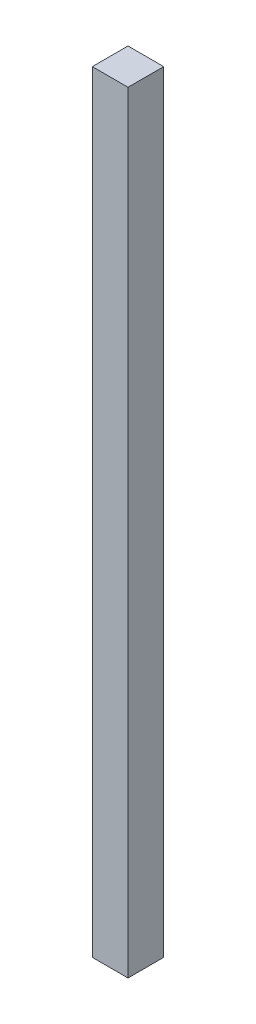
ISO-10303-21;
HEADER;
FILE_DESCRIPTION(('STEP AP214'),'2;1');
FILE_NAME('part.step','',(''),(''),'','','');
FILE_SCHEMA(('AUTOMOTIVE_DESIGN { 1 0 10303 214 1 1 1 1 }'));
ENDSEC;
DATA;
#1=APPLICATION_CONTEXT('core data for automotive mechanical design processes');
#2=APPLICATION_PROTOCOL_DEFINITION('international standard','automotive_design',2000,#1);
#3=PRODUCT_CONTEXT('',#1,'mechanical');
#4=PRODUCT('Part','Part','',(#3));
#5=PRODUCT_RELATED_PRODUCT_CATEGORY('part','',(#4));
#6=PRODUCT_DEFINITION_FORMATION('','',#4);
#7=PRODUCT_DEFINITION_CONTEXT('part definition',#1,'design');
#8=PRODUCT_DEFINITION('design','',#6,#7);
#9=PRODUCT_DEFINITION_SHAPE('','',#8);
#10=(LENGTH_UNIT() NAMED_UNIT(*) SI_UNIT(.MILLI.,.METRE.));
#11=(NAMED_UNIT(*) PLANE_ANGLE_UNIT() SI_UNIT($,.RADIAN.));
#12=(NAMED_UNIT(*) SI_UNIT($,.STERADIAN.) SOLID_ANGLE_UNIT());
#13=UNCERTAINTY_MEASURE_WITH_UNIT(LENGTH_MEASURE(1.E-05),#10,'distance_accuracy_value','');
#14=(GEOMETRIC_REPRESENTATION_CONTEXT(3) GLOBAL_UNCERTAINTY_ASSIGNED_CONTEXT((#13)) GLOBAL_UNIT_ASSIGNED_CONTEXT((#10,
#11,#12)) REPRESENTATION_CONTEXT('',''));
#15=CARTESIAN_POINT('',(0.,0.,0.));
#16=DIRECTION('',(0.,0.,1.));
#17=DIRECTION('',(1.,0.,0.));
#18=AXIS2_PLACEMENT_3D('',#15,#16,#17);
#19=CARTESIAN_POINT('',(0.,540.,0.));
#20=DIRECTION('',(-1.,0.,0.));
#21=DIRECTION('',(0.,0.,1.));
#22=AXIS2_PLACEMENT_3D('',#19,#20,#21);
#23=PLANE('',#22);
#24=DIRECTION('',(0.,0.,-1.));
#25=VECTOR('',#24,1.);
#26=CARTESIAN_POINT('',(0.,0.,0.));
#27=LINE('',#26,#25);
#28=CARTESIAN_POINT('',(0.,0.,25.));
#29=VERTEX_POINT('',#28);
#30=CARTESIAN_POINT('',(0.,0.,0.));
#31=VERTEX_POINT('',#30);
#32=EDGE_CURVE('E96',#29,#31,#27,.T.);
#33=ORIENTED_EDGE('',*,*,#32,.T.);
#34=DIRECTION('',(0.,-1.,0.));
#35=VECTOR('',#34,1.);
#36=CARTESIAN_POINT('',(0.,540.,0.));
#37=LINE('',#36,#35);
#38=CARTESIAN_POINT('',(0.,540.,0.));
#39=VERTEX_POINT('',#38);
#40=EDGE_CURVE('E11',#39,#31,#37,.T.);
#41=ORIENTED_EDGE('',*,*,#40,.F.);
#42=DIRECTION('',(0.,0.,-1.));
#43=VECTOR('',#42,1.);
#44=CARTESIAN_POINT('',(0.,540.,0.));
#45=LINE('',#44,#43);
#46=CARTESIAN_POINT('',(0.,540.,25.));
#47=VERTEX_POINT('',#46);
#48=EDGE_CURVE('E84',#47,#39,#45,.T.);
#49=ORIENTED_EDGE('',*,*,#48,.F.);
#50=DIRECTION('',(0.,-1.,0.));
#51=VECTOR('',#50,1.);
#52=CARTESIAN_POINT('',(0.,540.,25.));
#53=LINE('',#52,#51);
#54=EDGE_CURVE('E92',#47,#29,#53,.T.);
#55=ORIENTED_EDGE('',*,*,#54,.T.);
#56=EDGE_LOOP('',(#33,#41,#49,#55));
#57=FACE_BOUND('',#56,.T.);
#58=ADVANCED_FACE('F33',(#57),#23,.F.);
#59=CARTESIAN_POINT('',(0.,540.,0.));
#60=DIRECTION('',(0.,0.,1.));
#61=DIRECTION('',(1.,0.,0.));
#62=AXIS2_PLACEMENT_3D('',#59,#60,#61);
#63=PLANE('',#62);
#64=DIRECTION('',(-1.,0.,0.));
#65=VECTOR('',#64,1.);
#66=CARTESIAN_POINT('',(0.,0.,0.));
#67=LINE('',#66,#65);
#68=CARTESIAN_POINT('',(-25.,0.,0.));
#69=VERTEX_POINT('',#68);
#70=EDGE_CURVE('E88',#31,#69,#67,.T.);
#71=ORIENTED_EDGE('',*,*,#70,.T.);
#72=DIRECTION('',(0.,-1.,0.));
#73=VECTOR('',#72,1.);
#74=CARTESIAN_POINT('',(-25.,540.,0.));
#75=LINE('',#74,#73);
#76=CARTESIAN_POINT('',(-25.,540.,0.));
#77=VERTEX_POINT('',#76);
#78=EDGE_CURVE('E41',#77,#69,#75,.T.);
#79=ORIENTED_EDGE('',*,*,#78,.F.);
#80=DIRECTION('',(-1.,0.,0.));
#81=VECTOR('',#80,1.);
#82=CARTESIAN_POINT('',(0.,540.,0.));
#83=LINE('',#82,#81);
#84=EDGE_CURVE('E79',#39,#77,#83,.T.);
#85=ORIENTED_EDGE('',*,*,#84,.F.);
#86=ORIENTED_EDGE('',*,*,#40,.T.);
#87=EDGE_LOOP('',(#71,#79,#85,#86));
#88=FACE_BOUND('',#87,.T.);
#89=ADVANCED_FACE('F87',(#88),#63,.F.);
#90=CARTESIAN_POINT('',(-25.,540.,0.));
#91=DIRECTION('',(1.,0.,0.));
#92=DIRECTION('',(0.,0.,-1.));
#93=AXIS2_PLACEMENT_3D('',#90,#91,#92);
#94=PLANE('',#93);
#95=DIRECTION('',(0.,0.,1.));
#96=VECTOR('',#95,1.);
#97=CARTESIAN_POINT('',(-25.,0.,0.));
#98=LINE('',#97,#96);
#99=CARTESIAN_POINT('',(-25.,0.,25.));
#100=VERTEX_POINT('',#99);
#101=EDGE_CURVE('E66',#69,#100,#98,.T.);
#102=ORIENTED_EDGE('',*,*,#101,.T.);
#103=DIRECTION('',(0.,-1.,0.));
#104=VECTOR('',#103,1.);
#105=CARTESIAN_POINT('',(-25.,540.,25.));
#106=LINE('',#105,#104);
#107=CARTESIAN_POINT('',(-25.,540.,25.));
#108=VERTEX_POINT('',#107);
#109=EDGE_CURVE('E89',#108,#100,#106,.T.);
#110=ORIENTED_EDGE('',*,*,#109,.F.);
#111=DIRECTION('',(0.,0.,1.));
#112=VECTOR('',#111,1.);
#113=CARTESIAN_POINT('',(-25.,540.,0.));
#114=LINE('',#113,#112);
#115=EDGE_CURVE('E82',#77,#108,#114,.T.);
#116=ORIENTED_EDGE('',*,*,#115,.F.);
#117=ORIENTED_EDGE('',*,*,#78,.T.);
#118=EDGE_LOOP('',(#102,#110,#116,#117));
#119=FACE_BOUND('',#118,.T.);
#120=ADVANCED_FACE('F90',(#119),#94,.F.);
#121=CARTESIAN_POINT('',(0.,540.,25.));
#122=DIRECTION('',(0.,0.,-1.));
#123=DIRECTION('',(-1.,0.,0.));
#124=AXIS2_PLACEMENT_3D('',#121,#122,#123);
#125=PLANE('',#124);
#126=DIRECTION('',(1.,0.,0.));
#127=VECTOR('',#126,1.);
#128=CARTESIAN_POINT('',(0.,0.,25.));
#129=LINE('',#128,#127);
#130=EDGE_CURVE('E72',#100,#29,#129,.T.);
#131=ORIENTED_EDGE('',*,*,#130,.T.);
#132=ORIENTED_EDGE('',*,*,#54,.F.);
#133=DIRECTION('',(1.,0.,0.));
#134=VECTOR('',#133,1.);
#135=CARTESIAN_POINT('',(0.,540.,25.));
#136=LINE('',#135,#134);
#137=EDGE_CURVE('E49',#108,#47,#136,.T.);
#138=ORIENTED_EDGE('',*,*,#137,.F.);
#139=ORIENTED_EDGE('',*,*,#109,.T.);
#140=EDGE_LOOP('',(#131,#132,#138,#139));
#141=FACE_BOUND('',#140,.T.);
#142=ADVANCED_FACE('F103',(#141),#125,.F.);
#143=CARTESIAN_POINT('',(0.,540.,0.));
#144=DIRECTION('',(0.,-1.,0.));
#145=DIRECTION('',(0.,0.,-1.));
#146=AXIS2_PLACEMENT_3D('',#143,#144,#145);
#147=PLANE('',#146);
#148=ORIENTED_EDGE('',*,*,#48,.T.);
#149=ORIENTED_EDGE('',*,*,#84,.T.);
#150=ORIENTED_EDGE('',*,*,#115,.T.);
#151=ORIENTED_EDGE('',*,*,#137,.T.);
#152=EDGE_LOOP('',(#148,#149,#150,#151));
#153=FACE_BOUND('',#152,.T.);
#154=ADVANCED_FACE('F80',(#153),#147,.F.);
#155=CARTESIAN_POINT('',(0.,0.,0.));
#156=DIRECTION('',(0.,-1.,0.));
#157=DIRECTION('',(0.,0.,-1.));
#158=AXIS2_PLACEMENT_3D('',#155,#156,#157);
#159=PLANE('',#158);
#160=ORIENTED_EDGE('',*,*,#32,.F.);
#161=ORIENTED_EDGE('',*,*,#130,.F.);
#162=ORIENTED_EDGE('',*,*,#101,.F.);
#163=ORIENTED_EDGE('',*,*,#70,.F.);
#164=EDGE_LOOP('',(#160,#161,#162,#163));
#165=FACE_BOUND('',#164,.T.);
#166=ADVANCED_FACE('F106',(#165),#159,.T.);
#167=CLOSED_SHELL('',(#58,#89,#120,#142,#154,#166));
#168=MANIFOLD_SOLID_BREP('B2',#167);
#169=ADVANCED_BREP_SHAPE_REPRESENTATION('',(#18,#168),#14);
#170=SHAPE_DEFINITION_REPRESENTATION(#9,#169);
ENDSEC;
END-ISO-10303-21;
